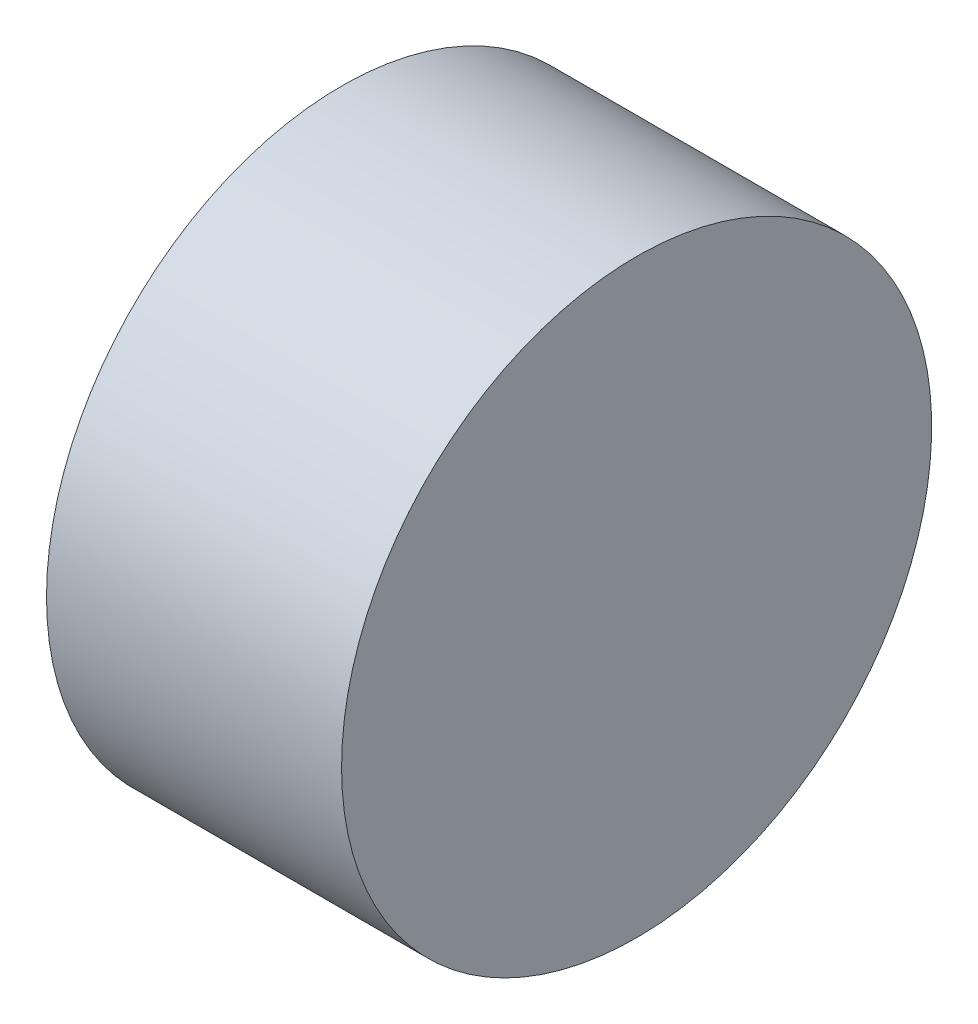
ISO-10303-21;
HEADER;
FILE_DESCRIPTION(('STEP AP214'),'2;1');
FILE_NAME('part.step','',(''),(''),'','','');
FILE_SCHEMA(('AUTOMOTIVE_DESIGN { 1 0 10303 214 1 1 1 1 }'));
ENDSEC;
DATA;
#1=APPLICATION_CONTEXT('core data for automotive mechanical design processes');
#2=APPLICATION_PROTOCOL_DEFINITION('international standard','automotive_design',2000,#1);
#3=PRODUCT_CONTEXT('',#1,'mechanical');
#4=PRODUCT('Part','Part','',(#3));
#5=PRODUCT_RELATED_PRODUCT_CATEGORY('part','',(#4));
#6=PRODUCT_DEFINITION_FORMATION('','',#4);
#7=PRODUCT_DEFINITION_CONTEXT('part definition',#1,'design');
#8=PRODUCT_DEFINITION('design','',#6,#7);
#9=PRODUCT_DEFINITION_SHAPE('','',#8);
#10=(LENGTH_UNIT() NAMED_UNIT(*) SI_UNIT(.MILLI.,.METRE.));
#11=(NAMED_UNIT(*) PLANE_ANGLE_UNIT() SI_UNIT($,.RADIAN.));
#12=(NAMED_UNIT(*) SI_UNIT($,.STERADIAN.) SOLID_ANGLE_UNIT());
#13=UNCERTAINTY_MEASURE_WITH_UNIT(LENGTH_MEASURE(1.E-05),#10,'distance_accuracy_value','');
#14=(GEOMETRIC_REPRESENTATION_CONTEXT(3) GLOBAL_UNCERTAINTY_ASSIGNED_CONTEXT((#13)) GLOBAL_UNIT_ASSIGNED_CONTEXT((#10,
#11,#12)) REPRESENTATION_CONTEXT('',''));
#15=CARTESIAN_POINT('',(0.,0.,0.));
#16=DIRECTION('',(0.,0.,1.));
#17=DIRECTION('',(1.,0.,0.));
#18=AXIS2_PLACEMENT_3D('',#15,#16,#17);
#19=CARTESIAN_POINT('',(-50.,0.,50.));
#20=DIRECTION('',(-1.,0.,0.));
#21=DIRECTION('',(0.,0.,1.));
#22=AXIS2_PLACEMENT_3D('',#19,#20,#21);
#23=PLANE('',#22);
#24=CARTESIAN_POINT('',(-50.,0.,-50.));
#25=DIRECTION('',(-1.,0.,0.));
#26=DIRECTION('',(0.,0.,1.));
#27=AXIS2_PLACEMENT_3D('',#24,#25,#26);
#28=CIRCLE('',#27,100.);
#29=CARTESIAN_POINT('',(-50.,0.,50.));
#30=VERTEX_POINT('',#29);
#31=EDGE_CURVE('E10',#30,#30,#28,.T.);
#32=ORIENTED_EDGE('',*,*,#31,.T.);
#33=EDGE_LOOP('',(#32));
#34=FACE_BOUND('',#33,.T.);
#35=ADVANCED_FACE('F39',(#34),#23,.T.);
#36=CARTESIAN_POINT('',(-50.,0.,-50.));
#37=DIRECTION('',(-1.,0.,0.));
#38=DIRECTION('',(0.,0.,1.));
#39=AXIS2_PLACEMENT_3D('',#36,#37,#38);
#40=CYLINDRICAL_SURFACE('',#39,100.);
#41=CARTESIAN_POINT('',(50.,0.,-50.));
#42=DIRECTION('',(-1.,0.,0.));
#43=DIRECTION('',(0.,0.,1.));
#44=AXIS2_PLACEMENT_3D('',#41,#42,#43);
#45=CIRCLE('',#44,100.);
#46=CARTESIAN_POINT('',(50.,0.,50.));
#47=VERTEX_POINT('',#46);
#48=EDGE_CURVE('E45',#47,#47,#45,.T.);
#49=ORIENTED_EDGE('',*,*,#48,.T.);
#50=EDGE_LOOP('',(#49));
#51=FACE_BOUND('',#50,.T.);
#52=ORIENTED_EDGE('',*,*,#31,.F.);
#53=EDGE_LOOP('',(#52));
#54=FACE_BOUND('',#53,.T.);
#55=ADVANCED_FACE('F51',(#51,#54),#40,.T.);
#56=CARTESIAN_POINT('',(50.,0.,50.));
#57=DIRECTION('',(1.,0.,0.));
#58=DIRECTION('',(0.,0.,-1.));
#59=AXIS2_PLACEMENT_3D('',#56,#57,#58);
#60=PLANE('',#59);
#61=ORIENTED_EDGE('',*,*,#48,.F.);
#62=EDGE_LOOP('',(#61));
#63=FACE_BOUND('',#62,.T.);
#64=ADVANCED_FACE('F54',(#63),#60,.T.);
#65=CLOSED_SHELL('',(#35,#55,#64));
#66=MANIFOLD_SOLID_BREP('B2',#65);
#67=ADVANCED_BREP_SHAPE_REPRESENTATION('',(#18,#66),#14);
#68=SHAPE_DEFINITION_REPRESENTATION(#9,#67);
ENDSEC;
END-ISO-10303-21;
